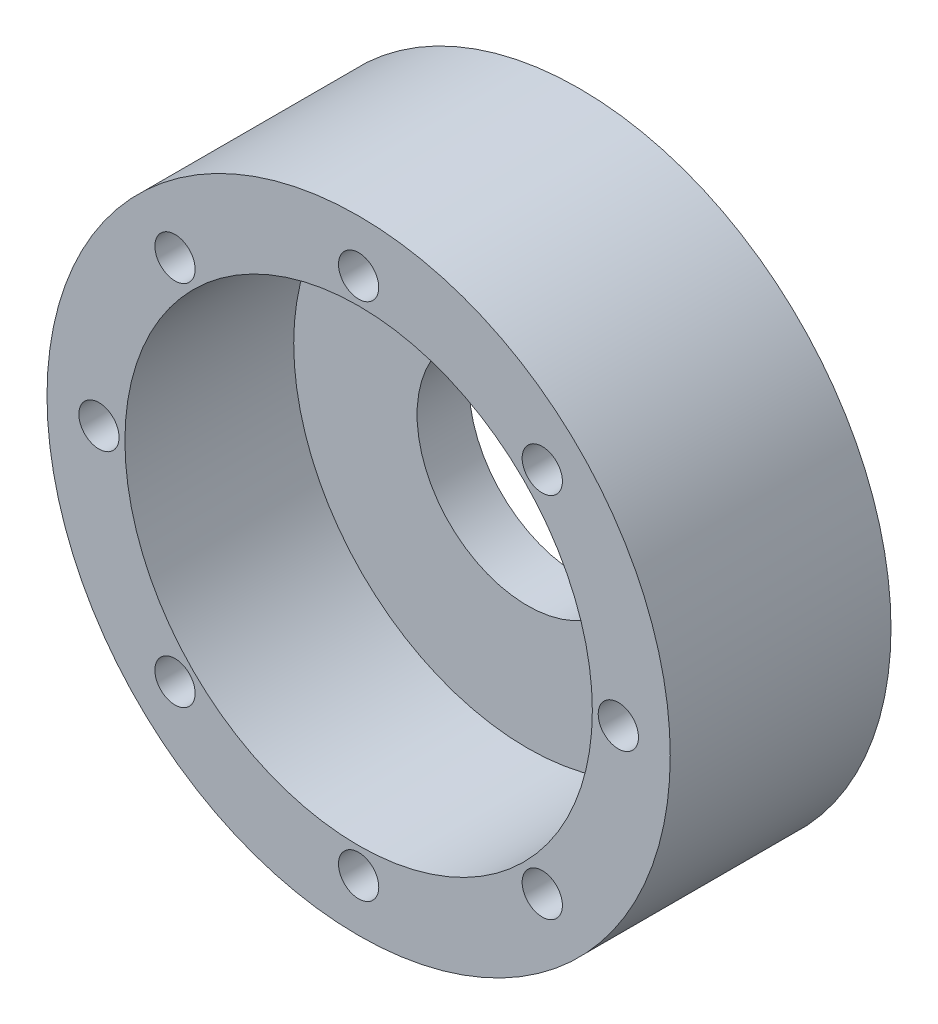
ISO-10303-21;
HEADER;
FILE_DESCRIPTION(('STEP AP214'),'2;1');
FILE_NAME('part.step','',(''),(''),'','','');
FILE_SCHEMA(('AUTOMOTIVE_DESIGN { 1 0 10303 214 1 1 1 1 }'));
ENDSEC;
DATA;
#1=APPLICATION_CONTEXT('core data for automotive mechanical design processes');
#2=APPLICATION_PROTOCOL_DEFINITION('international standard','automotive_design',2000,#1);
#3=PRODUCT_CONTEXT('',#1,'mechanical');
#4=PRODUCT('Part','Part','',(#3));
#5=PRODUCT_RELATED_PRODUCT_CATEGORY('part','',(#4));
#6=PRODUCT_DEFINITION_FORMATION('','',#4);
#7=PRODUCT_DEFINITION_CONTEXT('part definition',#1,'design');
#8=PRODUCT_DEFINITION('design','',#6,#7);
#9=PRODUCT_DEFINITION_SHAPE('','',#8);
#10=(LENGTH_UNIT() NAMED_UNIT(*) SI_UNIT(.MILLI.,.METRE.));
#11=(NAMED_UNIT(*) PLANE_ANGLE_UNIT() SI_UNIT($,.RADIAN.));
#12=(NAMED_UNIT(*) SI_UNIT($,.STERADIAN.) SOLID_ANGLE_UNIT());
#13=UNCERTAINTY_MEASURE_WITH_UNIT(LENGTH_MEASURE(1.E-05),#10,'distance_accuracy_value','');
#14=(GEOMETRIC_REPRESENTATION_CONTEXT(3) GLOBAL_UNCERTAINTY_ASSIGNED_CONTEXT((#13)) GLOBAL_UNIT_ASSIGNED_CONTEXT((#10,
#11,#12)) REPRESENTATION_CONTEXT('',''));
#15=CARTESIAN_POINT('',(0.,0.,0.));
#16=DIRECTION('',(0.,0.,1.));
#17=DIRECTION('',(1.,0.,0.));
#18=AXIS2_PLACEMENT_3D('',#15,#16,#17);
#19=CARTESIAN_POINT('',(0.,0.,17.));
#20=DIRECTION('',(0.,0.,-1.));
#21=DIRECTION('',(-1.,0.,0.));
#22=AXIS2_PLACEMENT_3D('',#19,#20,#21);
#23=CYLINDRICAL_SURFACE('',#22,8.5);
#24=CARTESIAN_POINT('',(0.,0.,0.));
#25=DIRECTION('',(0.,0.,1.));
#26=DIRECTION('',(1.,0.,0.));
#27=AXIS2_PLACEMENT_3D('',#24,#25,#26);
#28=CIRCLE('',#27,8.5);
#29=CARTESIAN_POINT('',(8.5,0.,0.));
#30=VERTEX_POINT('',#29);
#31=EDGE_CURVE('E101',#30,#30,#28,.T.);
#32=ORIENTED_EDGE('',*,*,#31,.F.);
#33=EDGE_LOOP('',(#32));
#34=FACE_BOUND('',#33,.T.);
#35=CARTESIAN_POINT('',(0.,0.,4.));
#36=DIRECTION('',(0.,0.,1.));
#37=DIRECTION('',(1.,0.,0.));
#38=AXIS2_PLACEMENT_3D('',#35,#36,#37);
#39=CIRCLE('',#38,8.5);
#40=CARTESIAN_POINT('',(8.5,0.,4.));
#41=VERTEX_POINT('',#40);
#42=EDGE_CURVE('E36',#41,#41,#39,.T.);
#43=ORIENTED_EDGE('',*,*,#42,.T.);
#44=EDGE_LOOP('',(#43));
#45=FACE_BOUND('',#44,.T.);
#46=ADVANCED_FACE('F32',(#34,#45),#23,.F.);
#47=CARTESIAN_POINT('',(0.,20.,17.));
#48=DIRECTION('',(0.,0.,-1.));
#49=DIRECTION('',(-1.,0.,0.));
#50=AXIS2_PLACEMENT_3D('',#47,#48,#49);
#51=CYLINDRICAL_SURFACE('',#50,1.55);
#52=CARTESIAN_POINT('',(0.,20.,17.));
#53=DIRECTION('',(0.,0.,1.));
#54=DIRECTION('',(1.,0.,0.));
#55=AXIS2_PLACEMENT_3D('',#52,#53,#54);
#56=CIRCLE('',#55,1.55);
#57=CARTESIAN_POINT('',(1.55,20.,17.));
#58=VERTEX_POINT('',#57);
#59=EDGE_CURVE('E45',#58,#58,#56,.T.);
#60=ORIENTED_EDGE('',*,*,#59,.T.);
#61=EDGE_LOOP('',(#60));
#62=FACE_BOUND('',#61,.T.);
#63=CARTESIAN_POINT('',(0.,20.,3.));
#64=DIRECTION('',(0.,0.,-1.));
#65=DIRECTION('',(-1.,0.,0.));
#66=AXIS2_PLACEMENT_3D('',#63,#64,#65);
#67=CIRCLE('',#66,1.55);
#68=CARTESIAN_POINT('',(-1.55,20.,3.));
#69=VERTEX_POINT('',#68);
#70=EDGE_CURVE('E71',#69,#69,#67,.T.);
#71=ORIENTED_EDGE('',*,*,#70,.T.);
#72=EDGE_LOOP('',(#71));
#73=FACE_BOUND('',#72,.T.);
#74=ADVANCED_FACE('F108',(#62,#73),#51,.F.);
#75=CARTESIAN_POINT('',(14.1421356237312,14.1421356237316,17.));
#76=DIRECTION('',(0.,0.,-1.));
#77=DIRECTION('',(-1.,0.,0.));
#78=AXIS2_PLACEMENT_3D('',#75,#76,#77);
#79=CYLINDRICAL_SURFACE('',#78,1.5500000000001);
#80=CARTESIAN_POINT('',(14.1421356237312,14.1421356237316,17.));
#81=DIRECTION('',(0.,0.,1.));
#82=DIRECTION('',(1.,0.,0.));
#83=AXIS2_PLACEMENT_3D('',#80,#81,#82);
#84=CIRCLE('',#83,1.5500000000001);
#85=CARTESIAN_POINT('',(15.6921356237313,14.1421356237316,17.));
#86=VERTEX_POINT('',#85);
#87=EDGE_CURVE('E99',#86,#86,#84,.T.);
#88=ORIENTED_EDGE('',*,*,#87,.T.);
#89=EDGE_LOOP('',(#88));
#90=FACE_BOUND('',#89,.T.);
#91=CARTESIAN_POINT('',(14.1421356237312,14.1421356237316,3.));
#92=DIRECTION('',(0.,0.,-1.));
#93=DIRECTION('',(-1.,0.,0.));
#94=AXIS2_PLACEMENT_3D('',#91,#92,#93);
#95=CIRCLE('',#94,1.5500000000001);
#96=CARTESIAN_POINT('',(12.5921356237311,14.1421356237316,3.));
#97=VERTEX_POINT('',#96);
#98=EDGE_CURVE('E69',#97,#97,#95,.T.);
#99=ORIENTED_EDGE('',*,*,#98,.T.);
#100=EDGE_LOOP('',(#99));
#101=FACE_BOUND('',#100,.T.);
#102=ADVANCED_FACE('F226',(#90,#101),#79,.F.);
#103=CARTESIAN_POINT('',(20.0000000000008,8.50201989313825E-13,17.));
#104=DIRECTION('',(0.,0.,-1.));
#105=DIRECTION('',(-1.,0.,0.));
#106=AXIS2_PLACEMENT_3D('',#103,#104,#105);
#107=CYLINDRICAL_SURFACE('',#106,1.55000000000063);
#108=CARTESIAN_POINT('',(20.0000000000008,8.50201989313825E-13,17.));
#109=DIRECTION('',(0.,0.,1.));
#110=DIRECTION('',(1.,0.,0.));
#111=AXIS2_PLACEMENT_3D('',#108,#109,#110);
#112=CIRCLE('',#111,1.55000000000063);
#113=CARTESIAN_POINT('',(21.5500000000015,8.50201989313825E-13,17.));
#114=VERTEX_POINT('',#113);
#115=EDGE_CURVE('E96',#114,#114,#112,.T.);
#116=ORIENTED_EDGE('',*,*,#115,.T.);
#117=EDGE_LOOP('',(#116));
#118=FACE_BOUND('',#117,.T.);
#119=CARTESIAN_POINT('',(20.0000000000008,8.50201989313825E-13,3.));
#120=DIRECTION('',(0.,0.,-1.));
#121=DIRECTION('',(-1.,0.,0.));
#122=AXIS2_PLACEMENT_3D('',#119,#120,#121);
#123=CIRCLE('',#122,1.55000000000063);
#124=CARTESIAN_POINT('',(18.4500000000002,8.50201989313825E-13,3.));
#125=VERTEX_POINT('',#124);
#126=EDGE_CURVE('E66',#125,#125,#123,.T.);
#127=ORIENTED_EDGE('',*,*,#126,.T.);
#128=EDGE_LOOP('',(#127));
#129=FACE_BOUND('',#128,.T.);
#130=ADVANCED_FACE('F232',(#118,#129),#107,.F.);
#131=CARTESIAN_POINT('',(14.1421356237324,-14.1421356237303,17.));
#132=DIRECTION('',(0.,0.,-1.));
#133=DIRECTION('',(-1.,0.,0.));
#134=AXIS2_PLACEMENT_3D('',#131,#132,#133);
#135=CYLINDRICAL_SURFACE('',#134,1.55000000000131);
#136=CARTESIAN_POINT('',(14.1421356237324,-14.1421356237303,17.));
#137=DIRECTION('',(0.,0.,1.));
#138=DIRECTION('',(1.,0.,0.));
#139=AXIS2_PLACEMENT_3D('',#136,#137,#138);
#140=CIRCLE('',#139,1.55000000000131);
#141=CARTESIAN_POINT('',(15.6921356237337,-14.1421356237303,17.));
#142=VERTEX_POINT('',#141);
#143=EDGE_CURVE('E93',#142,#142,#140,.T.);
#144=ORIENTED_EDGE('',*,*,#143,.T.);
#145=EDGE_LOOP('',(#144));
#146=FACE_BOUND('',#145,.T.);
#147=CARTESIAN_POINT('',(14.1421356237324,-14.1421356237303,3.));
#148=DIRECTION('',(0.,0.,-1.));
#149=DIRECTION('',(-1.,0.,0.));
#150=AXIS2_PLACEMENT_3D('',#147,#148,#149);
#151=CIRCLE('',#150,1.55000000000131);
#152=CARTESIAN_POINT('',(12.5921356237311,-14.1421356237303,3.));
#153=VERTEX_POINT('',#152);
#154=EDGE_CURVE('E63',#153,#153,#151,.T.);
#155=ORIENTED_EDGE('',*,*,#154,.T.);
#156=EDGE_LOOP('',(#155));
#157=FACE_BOUND('',#156,.T.);
#158=ADVANCED_FACE('F236',(#146,#157),#135,.F.);
#159=CARTESIAN_POINT('',(1.70040397862765E-12,-20.,17.));
#160=DIRECTION('',(0.,0.,-1.));
#161=DIRECTION('',(-1.,0.,0.));
#162=AXIS2_PLACEMENT_3D('',#159,#160,#161);
#163=CYLINDRICAL_SURFACE('',#162,1.55000000000176);
#164=CARTESIAN_POINT('',(1.70040397862765E-12,-20.,17.));
#165=DIRECTION('',(0.,0.,1.));
#166=DIRECTION('',(1.,0.,0.));
#167=AXIS2_PLACEMENT_3D('',#164,#165,#166);
#168=CIRCLE('',#167,1.55000000000176);
#169=CARTESIAN_POINT('',(1.55000000000346,-20.,17.));
#170=VERTEX_POINT('',#169);
#171=EDGE_CURVE('E90',#170,#170,#168,.T.);
#172=ORIENTED_EDGE('',*,*,#171,.T.);
#173=EDGE_LOOP('',(#172));
#174=FACE_BOUND('',#173,.T.);
#175=CARTESIAN_POINT('',(1.70040397862765E-12,-20.,3.));
#176=DIRECTION('',(0.,0.,-1.));
#177=DIRECTION('',(-1.,0.,0.));
#178=AXIS2_PLACEMENT_3D('',#175,#176,#177);
#179=CIRCLE('',#178,1.55000000000176);
#180=CARTESIAN_POINT('',(-1.55000000000006,-20.,3.));
#181=VERTEX_POINT('',#180);
#182=EDGE_CURVE('E60',#181,#181,#179,.T.);
#183=ORIENTED_EDGE('',*,*,#182,.T.);
#184=EDGE_LOOP('',(#183));
#185=FACE_BOUND('',#184,.T.);
#186=ADVANCED_FACE('F128',(#174,#185),#163,.F.);
#187=CARTESIAN_POINT('',(-14.1421356237295,-14.1421356237316,17.));
#188=DIRECTION('',(0.,0.,-1.));
#189=DIRECTION('',(-1.,0.,0.));
#190=AXIS2_PLACEMENT_3D('',#187,#188,#189);
#191=CYLINDRICAL_SURFACE('',#190,1.55000000000173);
#192=CARTESIAN_POINT('',(-14.1421356237295,-14.1421356237316,17.));
#193=DIRECTION('',(0.,0.,1.));
#194=DIRECTION('',(1.,0.,0.));
#195=AXIS2_PLACEMENT_3D('',#192,#193,#194);
#196=CIRCLE('',#195,1.55000000000173);
#197=CARTESIAN_POINT('',(-12.5921356237278,-14.1421356237316,17.));
#198=VERTEX_POINT('',#197);
#199=EDGE_CURVE('E82',#198,#198,#196,.T.);
#200=ORIENTED_EDGE('',*,*,#199,.T.);
#201=EDGE_LOOP('',(#200));
#202=FACE_BOUND('',#201,.T.);
#203=CARTESIAN_POINT('',(-14.1421356237295,-14.1421356237316,3.));
#204=DIRECTION('',(0.,0.,-1.));
#205=DIRECTION('',(-1.,0.,0.));
#206=AXIS2_PLACEMENT_3D('',#203,#204,#205);
#207=CIRCLE('',#206,1.55000000000173);
#208=CARTESIAN_POINT('',(-15.6921356237312,-14.1421356237316,3.));
#209=VERTEX_POINT('',#208);
#210=EDGE_CURVE('E57',#209,#209,#207,.T.);
#211=ORIENTED_EDGE('',*,*,#210,.T.);
#212=EDGE_LOOP('',(#211));
#213=FACE_BOUND('',#212,.T.);
#214=ADVANCED_FACE('F124',(#202,#213),#191,.F.);
#215=CARTESIAN_POINT('',(-19.9999999999992,-8.5265128291212E-13,17.));
#216=DIRECTION('',(0.,0.,-1.));
#217=DIRECTION('',(-1.,0.,0.));
#218=AXIS2_PLACEMENT_3D('',#215,#216,#217);
#219=CYLINDRICAL_SURFACE('',#218,1.55000000000126);
#220=CARTESIAN_POINT('',(-19.9999999999992,-8.5265128291212E-13,17.));
#221=DIRECTION('',(0.,0.,1.));
#222=DIRECTION('',(1.,0.,0.));
#223=AXIS2_PLACEMENT_3D('',#220,#221,#222);
#224=CIRCLE('',#223,1.55000000000126);
#225=CARTESIAN_POINT('',(-18.4499999999979,-8.5265128291212E-13,17.));
#226=VERTEX_POINT('',#225);
#227=EDGE_CURVE('E77',#226,#226,#224,.T.);
#228=ORIENTED_EDGE('',*,*,#227,.T.);
#229=EDGE_LOOP('',(#228));
#230=FACE_BOUND('',#229,.T.);
#231=CARTESIAN_POINT('',(-19.9999999999992,-8.5265128291212E-13,3.));
#232=DIRECTION('',(0.,0.,-1.));
#233=DIRECTION('',(-1.,0.,0.));
#234=AXIS2_PLACEMENT_3D('',#231,#232,#233);
#235=CIRCLE('',#234,1.55000000000126);
#236=CARTESIAN_POINT('',(-21.5500000000004,-8.5265128291212E-13,3.));
#237=VERTEX_POINT('',#236);
#238=EDGE_CURVE('E53',#237,#237,#235,.T.);
#239=ORIENTED_EDGE('',*,*,#238,.T.);
#240=EDGE_LOOP('',(#239));
#241=FACE_BOUND('',#240,.T.);
#242=ADVANCED_FACE('F127',(#230,#241),#219,.F.);
#243=CARTESIAN_POINT('',(-14.1421356237307,14.1421356237303,17.));
#244=DIRECTION('',(0.,0.,-1.));
#245=DIRECTION('',(-1.,0.,0.));
#246=AXIS2_PLACEMENT_3D('',#243,#244,#245);
#247=CYLINDRICAL_SURFACE('',#246,1.55000000000065);
#248=CARTESIAN_POINT('',(-14.1421356237307,14.1421356237303,17.));
#249=DIRECTION('',(0.,0.,1.));
#250=DIRECTION('',(1.,0.,0.));
#251=AXIS2_PLACEMENT_3D('',#248,#249,#250);
#252=CIRCLE('',#251,1.55000000000065);
#253=CARTESIAN_POINT('',(-12.5921356237301,14.1421356237303,17.));
#254=VERTEX_POINT('',#253);
#255=EDGE_CURVE('E73',#254,#254,#252,.T.);
#256=ORIENTED_EDGE('',*,*,#255,.T.);
#257=EDGE_LOOP('',(#256));
#258=FACE_BOUND('',#257,.T.);
#259=CARTESIAN_POINT('',(-14.1421356237307,14.1421356237303,3.));
#260=DIRECTION('',(0.,0.,-1.));
#261=DIRECTION('',(-1.,0.,0.));
#262=AXIS2_PLACEMENT_3D('',#259,#260,#261);
#263=CIRCLE('',#262,1.55000000000065);
#264=CARTESIAN_POINT('',(-15.6921356237314,14.1421356237303,3.));
#265=VERTEX_POINT('',#264);
#266=EDGE_CURVE('E50',#265,#265,#263,.T.);
#267=ORIENTED_EDGE('',*,*,#266,.T.);
#268=EDGE_LOOP('',(#267));
#269=FACE_BOUND('',#268,.T.);
#270=ADVANCED_FACE('F114',(#258,#269),#247,.F.);
#271=CARTESIAN_POINT('',(0.,0.,17.));
#272=DIRECTION('',(0.,0.,1.));
#273=DIRECTION('',(1.,0.,0.));
#274=AXIS2_PLACEMENT_3D('',#271,#272,#273);
#275=PLANE('',#274);
#276=CARTESIAN_POINT('',(0.,0.,17.));
#277=DIRECTION('',(0.,0.,1.));
#278=DIRECTION('',(1.,0.,0.));
#279=AXIS2_PLACEMENT_3D('',#276,#277,#278);
#280=CIRCLE('',#279,18.);
#281=CARTESIAN_POINT('',(18.,0.,17.));
#282=VERTEX_POINT('',#281);
#283=EDGE_CURVE('E190',#282,#282,#280,.T.);
#284=ORIENTED_EDGE('',*,*,#283,.F.);
#285=EDGE_LOOP('',(#284));
#286=FACE_BOUND('',#285,.T.);
#287=ORIENTED_EDGE('',*,*,#227,.F.);
#288=EDGE_LOOP('',(#287));
#289=FACE_BOUND('',#288,.T.);
#290=ORIENTED_EDGE('',*,*,#171,.F.);
#291=EDGE_LOOP('',(#290));
#292=FACE_BOUND('',#291,.T.);
#293=ORIENTED_EDGE('',*,*,#115,.F.);
#294=EDGE_LOOP('',(#293));
#295=FACE_BOUND('',#294,.T.);
#296=CARTESIAN_POINT('',(0.,0.,17.));
#297=DIRECTION('',(0.,0.,1.));
#298=DIRECTION('',(1.,0.,0.));
#299=AXIS2_PLACEMENT_3D('',#296,#297,#298);
#300=CIRCLE('',#299,24.);
#301=CARTESIAN_POINT('',(24.,0.,17.));
#302=VERTEX_POINT('',#301);
#303=EDGE_CURVE('E10',#302,#302,#300,.T.);
#304=ORIENTED_EDGE('',*,*,#303,.T.);
#305=EDGE_LOOP('',(#304));
#306=FACE_BOUND('',#305,.T.);
#307=ORIENTED_EDGE('',*,*,#59,.F.);
#308=EDGE_LOOP('',(#307));
#309=FACE_BOUND('',#308,.T.);
#310=ORIENTED_EDGE('',*,*,#87,.F.);
#311=EDGE_LOOP('',(#310));
#312=FACE_BOUND('',#311,.T.);
#313=ORIENTED_EDGE('',*,*,#143,.F.);
#314=EDGE_LOOP('',(#313));
#315=FACE_BOUND('',#314,.T.);
#316=ORIENTED_EDGE('',*,*,#199,.F.);
#317=EDGE_LOOP('',(#316));
#318=FACE_BOUND('',#317,.T.);
#319=ORIENTED_EDGE('',*,*,#255,.F.);
#320=EDGE_LOOP('',(#319));
#321=FACE_BOUND('',#320,.T.);
#322=ADVANCED_FACE('F110',(#286,#289,#292,#295,#306,#309,#312,#315,#318,#321),#275,.T.);
#323=CARTESIAN_POINT('',(0.,0.,0.));
#324=DIRECTION('',(0.,0.,1.));
#325=DIRECTION('',(1.,0.,0.));
#326=AXIS2_PLACEMENT_3D('',#323,#324,#325);
#327=PLANE('',#326);
#328=CARTESIAN_POINT('',(14.1421356237307,14.1421356237303,0.));
#329=DIRECTION('',(0.,0.,-1.));
#330=DIRECTION('',(-1.,0.,0.));
#331=AXIS2_PLACEMENT_3D('',#328,#329,#330);
#332=CIRCLE('',#331,3.5);
#333=CARTESIAN_POINT('',(10.6421356237307,14.1421356237303,0.));
#334=VERTEX_POINT('',#333);
#335=EDGE_CURVE('E173',#334,#334,#332,.T.);
#336=ORIENTED_EDGE('',*,*,#335,.F.);
#337=EDGE_LOOP('',(#336));
#338=FACE_BOUND('',#337,.T.);
#339=CARTESIAN_POINT('',(19.9999999999992,-8.5265128291212E-13,0.));
#340=DIRECTION('',(0.,0.,-1.));
#341=DIRECTION('',(-1.,0.,0.));
#342=AXIS2_PLACEMENT_3D('',#339,#340,#341);
#343=CIRCLE('',#342,3.5);
#344=CARTESIAN_POINT('',(16.4999999999992,-8.5265128291212E-13,0.));
#345=VERTEX_POINT('',#344);
#346=EDGE_CURVE('E167',#345,#345,#343,.T.);
#347=ORIENTED_EDGE('',*,*,#346,.F.);
#348=EDGE_LOOP('',(#347));
#349=FACE_BOUND('',#348,.T.);
#350=CARTESIAN_POINT('',(14.1421356237295,-14.1421356237316,0.));
#351=DIRECTION('',(0.,0.,-1.));
#352=DIRECTION('',(-1.,0.,0.));
#353=AXIS2_PLACEMENT_3D('',#350,#351,#352);
#354=CIRCLE('',#353,3.5);
#355=CARTESIAN_POINT('',(10.6421356237295,-14.1421356237316,0.));
#356=VERTEX_POINT('',#355);
#357=EDGE_CURVE('E161',#356,#356,#354,.T.);
#358=ORIENTED_EDGE('',*,*,#357,.F.);
#359=EDGE_LOOP('',(#358));
#360=FACE_BOUND('',#359,.T.);
#361=CARTESIAN_POINT('',(-1.70040397862765E-12,-20.,0.));
#362=DIRECTION('',(0.,0.,-1.));
#363=DIRECTION('',(-1.,0.,0.));
#364=AXIS2_PLACEMENT_3D('',#361,#362,#363);
#365=CIRCLE('',#364,3.5);
#366=CARTESIAN_POINT('',(-3.5000000000017,-20.,0.));
#367=VERTEX_POINT('',#366);
#368=EDGE_CURVE('E155',#367,#367,#365,.T.);
#369=ORIENTED_EDGE('',*,*,#368,.F.);
#370=EDGE_LOOP('',(#369));
#371=FACE_BOUND('',#370,.T.);
#372=CARTESIAN_POINT('',(-14.1421356237324,-14.1421356237303,0.));
#373=DIRECTION('',(0.,0.,-1.));
#374=DIRECTION('',(-1.,0.,0.));
#375=AXIS2_PLACEMENT_3D('',#372,#373,#374);
#376=CIRCLE('',#375,3.5);
#377=CARTESIAN_POINT('',(-17.6421356237324,-14.1421356237303,0.));
#378=VERTEX_POINT('',#377);
#379=EDGE_CURVE('E143',#378,#378,#376,.T.);
#380=ORIENTED_EDGE('',*,*,#379,.F.);
#381=EDGE_LOOP('',(#380));
#382=FACE_BOUND('',#381,.T.);
#383=CARTESIAN_POINT('',(-20.0000000000008,8.50201989313825E-13,0.));
#384=DIRECTION('',(0.,0.,-1.));
#385=DIRECTION('',(-1.,0.,0.));
#386=AXIS2_PLACEMENT_3D('',#383,#384,#385);
#387=CIRCLE('',#386,3.5);
#388=CARTESIAN_POINT('',(-23.5000000000008,8.50201989313825E-13,0.));
#389=VERTEX_POINT('',#388);
#390=EDGE_CURVE('E142',#389,#389,#387,.T.);
#391=ORIENTED_EDGE('',*,*,#390,.F.);
#392=EDGE_LOOP('',(#391));
#393=FACE_BOUND('',#392,.T.);
#394=CARTESIAN_POINT('',(-14.1421356237312,14.1421356237316,0.));
#395=DIRECTION('',(0.,0.,-1.));
#396=DIRECTION('',(-1.,0.,0.));
#397=AXIS2_PLACEMENT_3D('',#394,#395,#396);
#398=CIRCLE('',#397,3.5);
#399=CARTESIAN_POINT('',(-17.6421356237312,14.1421356237316,0.));
#400=VERTEX_POINT('',#399);
#401=EDGE_CURVE('E183',#400,#400,#398,.T.);
#402=ORIENTED_EDGE('',*,*,#401,.F.);
#403=EDGE_LOOP('',(#402));
#404=FACE_BOUND('',#403,.T.);
#405=CARTESIAN_POINT('',(0.,20.,0.));
#406=DIRECTION('',(0.,0.,-1.));
#407=DIRECTION('',(-1.,0.,0.));
#408=AXIS2_PLACEMENT_3D('',#405,#406,#407);
#409=CIRCLE('',#408,3.5);
#410=CARTESIAN_POINT('',(-3.5,20.,0.));
#411=VERTEX_POINT('',#410);
#412=EDGE_CURVE('E85',#411,#411,#409,.T.);
#413=ORIENTED_EDGE('',*,*,#412,.F.);
#414=EDGE_LOOP('',(#413));
#415=FACE_BOUND('',#414,.T.);
#416=CARTESIAN_POINT('',(0.,0.,0.));
#417=DIRECTION('',(0.,0.,1.));
#418=DIRECTION('',(1.,0.,0.));
#419=AXIS2_PLACEMENT_3D('',#416,#417,#418);
#420=CIRCLE('',#419,24.);
#421=CARTESIAN_POINT('',(24.,0.,0.));
#422=VERTEX_POINT('',#421);
#423=EDGE_CURVE('E40',#422,#422,#420,.T.);
#424=ORIENTED_EDGE('',*,*,#423,.F.);
#425=EDGE_LOOP('',(#424));
#426=FACE_BOUND('',#425,.T.);
#427=ORIENTED_EDGE('',*,*,#31,.T.);
#428=EDGE_LOOP('',(#427));
#429=FACE_BOUND('',#428,.T.);
#430=ADVANCED_FACE('F113',(#338,#349,#360,#371,#382,#393,#404,#415,#426,#429),#327,.F.);
#431=CARTESIAN_POINT('',(0.,0.,17.));
#432=DIRECTION('',(0.,0.,-1.));
#433=DIRECTION('',(-1.,0.,0.));
#434=AXIS2_PLACEMENT_3D('',#431,#432,#433);
#435=CYLINDRICAL_SURFACE('',#434,24.);
#436=ORIENTED_EDGE('',*,*,#303,.F.);
#437=EDGE_LOOP('',(#436));
#438=FACE_BOUND('',#437,.T.);
#439=ORIENTED_EDGE('',*,*,#423,.T.);
#440=EDGE_LOOP('',(#439));
#441=FACE_BOUND('',#440,.T.);
#442=ADVANCED_FACE('F34',(#438,#441),#435,.T.);
#443=CARTESIAN_POINT('',(-14.1421356237312,14.1421356237316,3.));
#444=DIRECTION('',(0.,0.,-1.));
#445=DIRECTION('',(-1.,0.,0.));
#446=AXIS2_PLACEMENT_3D('',#443,#444,#445);
#447=CYLINDRICAL_SURFACE('',#446,3.5);
#448=CARTESIAN_POINT('',(-14.1421356237312,14.1421356237316,3.));
#449=DIRECTION('',(0.,0.,-1.));
#450=DIRECTION('',(-1.,0.,0.));
#451=AXIS2_PLACEMENT_3D('',#448,#449,#450);
#452=CIRCLE('',#451,3.5);
#453=CARTESIAN_POINT('',(-17.6421356237312,14.1421356237316,3.));
#454=VERTEX_POINT('',#453);
#455=EDGE_CURVE('E179',#454,#454,#452,.T.);
#456=ORIENTED_EDGE('',*,*,#455,.F.);
#457=EDGE_LOOP('',(#456));
#458=FACE_BOUND('',#457,.T.);
#459=ORIENTED_EDGE('',*,*,#401,.T.);
#460=EDGE_LOOP('',(#459));
#461=FACE_BOUND('',#460,.T.);
#462=ADVANCED_FACE('F213',(#458,#461),#447,.F.);
#463=CARTESIAN_POINT('',(-14.1421356237312,14.1421356237316,3.));
#464=DIRECTION('',(0.,0.,-1.));
#465=DIRECTION('',(-1.,0.,0.));
#466=AXIS2_PLACEMENT_3D('',#463,#464,#465);
#467=PLANE('',#466);
#468=ORIENTED_EDGE('',*,*,#266,.F.);
#469=EDGE_LOOP('',(#468));
#470=FACE_BOUND('',#469,.T.);
#471=ORIENTED_EDGE('',*,*,#455,.T.);
#472=EDGE_LOOP('',(#471));
#473=FACE_BOUND('',#472,.T.);
#474=ADVANCED_FACE('F200',(#470,#473),#467,.T.);
#475=CARTESIAN_POINT('',(-20.0000000000008,8.50201989313825E-13,3.));
#476=DIRECTION('',(0.,0.,-1.));
#477=DIRECTION('',(-1.,0.,0.));
#478=AXIS2_PLACEMENT_3D('',#475,#476,#477);
#479=CYLINDRICAL_SURFACE('',#478,3.5);
#480=CARTESIAN_POINT('',(-20.0000000000008,8.50201989313825E-13,3.));
#481=DIRECTION('',(0.,0.,-1.));
#482=DIRECTION('',(-1.,0.,0.));
#483=AXIS2_PLACEMENT_3D('',#480,#481,#482);
#484=CIRCLE('',#483,3.5);
#485=CARTESIAN_POINT('',(-23.5000000000008,8.50201989313825E-13,3.));
#486=VERTEX_POINT('',#485);
#487=EDGE_CURVE('E146',#486,#486,#484,.T.);
#488=ORIENTED_EDGE('',*,*,#487,.F.);
#489=EDGE_LOOP('',(#488));
#490=FACE_BOUND('',#489,.T.);
#491=ORIENTED_EDGE('',*,*,#390,.T.);
#492=EDGE_LOOP('',(#491));
#493=FACE_BOUND('',#492,.T.);
#494=ADVANCED_FACE('F197',(#490,#493),#479,.F.);
#495=CARTESIAN_POINT('',(-20.0000000000008,8.50201989313825E-13,3.));
#496=DIRECTION('',(0.,0.,-1.));
#497=DIRECTION('',(-1.,0.,0.));
#498=AXIS2_PLACEMENT_3D('',#495,#496,#497);
#499=PLANE('',#498);
#500=ORIENTED_EDGE('',*,*,#238,.F.);
#501=EDGE_LOOP('',(#500));
#502=FACE_BOUND('',#501,.T.);
#503=ORIENTED_EDGE('',*,*,#487,.T.);
#504=EDGE_LOOP('',(#503));
#505=FACE_BOUND('',#504,.T.);
#506=ADVANCED_FACE('F195',(#502,#505),#499,.T.);
#507=CARTESIAN_POINT('',(-14.1421356237324,-14.1421356237303,3.));
#508=DIRECTION('',(0.,0.,-1.));
#509=DIRECTION('',(-1.,0.,0.));
#510=AXIS2_PLACEMENT_3D('',#507,#508,#509);
#511=CYLINDRICAL_SURFACE('',#510,3.5);
#512=CARTESIAN_POINT('',(-14.1421356237324,-14.1421356237303,3.));
#513=DIRECTION('',(0.,0.,-1.));
#514=DIRECTION('',(-1.,0.,0.));
#515=AXIS2_PLACEMENT_3D('',#512,#513,#514);
#516=CIRCLE('',#515,3.5);
#517=CARTESIAN_POINT('',(-17.6421356237324,-14.1421356237303,3.));
#518=VERTEX_POINT('',#517);
#519=EDGE_CURVE('E140',#518,#518,#516,.T.);
#520=ORIENTED_EDGE('',*,*,#519,.F.);
#521=EDGE_LOOP('',(#520));
#522=FACE_BOUND('',#521,.T.);
#523=ORIENTED_EDGE('',*,*,#379,.T.);
#524=EDGE_LOOP('',(#523));
#525=FACE_BOUND('',#524,.T.);
#526=ADVANCED_FACE('F136',(#522,#525),#511,.F.);
#527=CARTESIAN_POINT('',(-14.1421356237324,-14.1421356237303,3.));
#528=DIRECTION('',(0.,0.,-1.));
#529=DIRECTION('',(-1.,0.,0.));
#530=AXIS2_PLACEMENT_3D('',#527,#528,#529);
#531=PLANE('',#530);
#532=ORIENTED_EDGE('',*,*,#210,.F.);
#533=EDGE_LOOP('',(#532));
#534=FACE_BOUND('',#533,.T.);
#535=ORIENTED_EDGE('',*,*,#519,.T.);
#536=EDGE_LOOP('',(#535));
#537=FACE_BOUND('',#536,.T.);
#538=ADVANCED_FACE('F132',(#534,#537),#531,.T.);
#539=CARTESIAN_POINT('',(-1.70040397862765E-12,-20.,3.));
#540=DIRECTION('',(0.,0.,-1.));
#541=DIRECTION('',(-1.,0.,0.));
#542=AXIS2_PLACEMENT_3D('',#539,#540,#541);
#543=CYLINDRICAL_SURFACE('',#542,3.5);
#544=CARTESIAN_POINT('',(-1.70040397862765E-12,-20.,3.));
#545=DIRECTION('',(0.,0.,-1.));
#546=DIRECTION('',(-1.,0.,0.));
#547=AXIS2_PLACEMENT_3D('',#544,#545,#546);
#548=CIRCLE('',#547,3.5);
#549=CARTESIAN_POINT('',(-3.5000000000017,-20.,3.));
#550=VERTEX_POINT('',#549);
#551=EDGE_CURVE('E149',#550,#550,#548,.T.);
#552=ORIENTED_EDGE('',*,*,#551,.F.);
#553=EDGE_LOOP('',(#552));
#554=FACE_BOUND('',#553,.T.);
#555=ORIENTED_EDGE('',*,*,#368,.T.);
#556=EDGE_LOOP('',(#555));
#557=FACE_BOUND('',#556,.T.);
#558=ADVANCED_FACE('F135',(#554,#557),#543,.F.);
#559=CARTESIAN_POINT('',(-1.70040397862765E-12,-20.,3.));
#560=DIRECTION('',(0.,0.,-1.));
#561=DIRECTION('',(-1.,0.,0.));
#562=AXIS2_PLACEMENT_3D('',#559,#560,#561);
#563=PLANE('',#562);
#564=ORIENTED_EDGE('',*,*,#182,.F.);
#565=EDGE_LOOP('',(#564));
#566=FACE_BOUND('',#565,.T.);
#567=ORIENTED_EDGE('',*,*,#551,.T.);
#568=EDGE_LOOP('',(#567));
#569=FACE_BOUND('',#568,.T.);
#570=ADVANCED_FACE('F278',(#566,#569),#563,.T.);
#571=CARTESIAN_POINT('',(14.1421356237295,-14.1421356237316,3.));
#572=DIRECTION('',(0.,0.,-1.));
#573=DIRECTION('',(-1.,0.,0.));
#574=AXIS2_PLACEMENT_3D('',#571,#572,#573);
#575=CYLINDRICAL_SURFACE('',#574,3.5);
#576=CARTESIAN_POINT('',(14.1421356237295,-14.1421356237316,3.));
#577=DIRECTION('',(0.,0.,-1.));
#578=DIRECTION('',(-1.,0.,0.));
#579=AXIS2_PLACEMENT_3D('',#576,#577,#578);
#580=CIRCLE('',#579,3.5);
#581=CARTESIAN_POINT('',(10.6421356237295,-14.1421356237316,3.));
#582=VERTEX_POINT('',#581);
#583=EDGE_CURVE('E158',#582,#582,#580,.T.);
#584=ORIENTED_EDGE('',*,*,#583,.F.);
#585=EDGE_LOOP('',(#584));
#586=FACE_BOUND('',#585,.T.);
#587=ORIENTED_EDGE('',*,*,#357,.T.);
#588=EDGE_LOOP('',(#587));
#589=FACE_BOUND('',#588,.T.);
#590=ADVANCED_FACE('F275',(#586,#589),#575,.F.);
#591=CARTESIAN_POINT('',(14.1421356237295,-14.1421356237316,3.));
#592=DIRECTION('',(0.,0.,-1.));
#593=DIRECTION('',(-1.,0.,0.));
#594=AXIS2_PLACEMENT_3D('',#591,#592,#593);
#595=PLANE('',#594);
#596=ORIENTED_EDGE('',*,*,#154,.F.);
#597=EDGE_LOOP('',(#596));
#598=FACE_BOUND('',#597,.T.);
#599=ORIENTED_EDGE('',*,*,#583,.T.);
#600=EDGE_LOOP('',(#599));
#601=FACE_BOUND('',#600,.T.);
#602=ADVANCED_FACE('F270',(#598,#601),#595,.T.);
#603=CARTESIAN_POINT('',(19.9999999999992,-8.5265128291212E-13,3.));
#604=DIRECTION('',(0.,0.,-1.));
#605=DIRECTION('',(-1.,0.,0.));
#606=AXIS2_PLACEMENT_3D('',#603,#604,#605);
#607=CYLINDRICAL_SURFACE('',#606,3.5);
#608=CARTESIAN_POINT('',(19.9999999999992,-8.5265128291212E-13,3.));
#609=DIRECTION('',(0.,0.,-1.));
#610=DIRECTION('',(-1.,0.,0.));
#611=AXIS2_PLACEMENT_3D('',#608,#609,#610);
#612=CIRCLE('',#611,3.5);
#613=CARTESIAN_POINT('',(16.4999999999992,-8.5265128291212E-13,3.));
#614=VERTEX_POINT('',#613);
#615=EDGE_CURVE('E164',#614,#614,#612,.T.);
#616=ORIENTED_EDGE('',*,*,#615,.F.);
#617=EDGE_LOOP('',(#616));
#618=FACE_BOUND('',#617,.T.);
#619=ORIENTED_EDGE('',*,*,#346,.T.);
#620=EDGE_LOOP('',(#619));
#621=FACE_BOUND('',#620,.T.);
#622=ADVANCED_FACE('F267',(#618,#621),#607,.F.);
#623=CARTESIAN_POINT('',(19.9999999999992,-8.5265128291212E-13,3.));
#624=DIRECTION('',(0.,0.,-1.));
#625=DIRECTION('',(-1.,0.,0.));
#626=AXIS2_PLACEMENT_3D('',#623,#624,#625);
#627=PLANE('',#626);
#628=ORIENTED_EDGE('',*,*,#126,.F.);
#629=EDGE_LOOP('',(#628));
#630=FACE_BOUND('',#629,.T.);
#631=ORIENTED_EDGE('',*,*,#615,.T.);
#632=EDGE_LOOP('',(#631));
#633=FACE_BOUND('',#632,.T.);
#634=ADVANCED_FACE('F262',(#630,#633),#627,.T.);
#635=CARTESIAN_POINT('',(14.1421356237307,14.1421356237303,3.));
#636=DIRECTION('',(0.,0.,-1.));
#637=DIRECTION('',(-1.,0.,0.));
#638=AXIS2_PLACEMENT_3D('',#635,#636,#637);
#639=CYLINDRICAL_SURFACE('',#638,3.5);
#640=CARTESIAN_POINT('',(14.1421356237307,14.1421356237303,3.));
#641=DIRECTION('',(0.,0.,-1.));
#642=DIRECTION('',(-1.,0.,0.));
#643=AXIS2_PLACEMENT_3D('',#640,#641,#642);
#644=CIRCLE('',#643,3.5);
#645=CARTESIAN_POINT('',(10.6421356237307,14.1421356237303,3.));
#646=VERTEX_POINT('',#645);
#647=EDGE_CURVE('E170',#646,#646,#644,.T.);
#648=ORIENTED_EDGE('',*,*,#647,.F.);
#649=EDGE_LOOP('',(#648));
#650=FACE_BOUND('',#649,.T.);
#651=ORIENTED_EDGE('',*,*,#335,.T.);
#652=EDGE_LOOP('',(#651));
#653=FACE_BOUND('',#652,.T.);
#654=ADVANCED_FACE('F259',(#650,#653),#639,.F.);
#655=CARTESIAN_POINT('',(14.1421356237307,14.1421356237303,3.));
#656=DIRECTION('',(0.,0.,-1.));
#657=DIRECTION('',(-1.,0.,0.));
#658=AXIS2_PLACEMENT_3D('',#655,#656,#657);
#659=PLANE('',#658);
#660=ORIENTED_EDGE('',*,*,#98,.F.);
#661=EDGE_LOOP('',(#660));
#662=FACE_BOUND('',#661,.T.);
#663=ORIENTED_EDGE('',*,*,#647,.T.);
#664=EDGE_LOOP('',(#663));
#665=FACE_BOUND('',#664,.T.);
#666=ADVANCED_FACE('F253',(#662,#665),#659,.T.);
#667=CARTESIAN_POINT('',(0.,20.,3.));
#668=DIRECTION('',(0.,0.,-1.));
#669=DIRECTION('',(-1.,0.,0.));
#670=AXIS2_PLACEMENT_3D('',#667,#668,#669);
#671=CYLINDRICAL_SURFACE('',#670,3.5);
#672=CARTESIAN_POINT('',(0.,20.,3.));
#673=DIRECTION('',(0.,0.,-1.));
#674=DIRECTION('',(-1.,0.,0.));
#675=AXIS2_PLACEMENT_3D('',#672,#673,#674);
#676=CIRCLE('',#675,3.5);
#677=CARTESIAN_POINT('',(-3.5,20.,3.));
#678=VERTEX_POINT('',#677);
#679=EDGE_CURVE('E54',#678,#678,#676,.T.);
#680=ORIENTED_EDGE('',*,*,#679,.F.);
#681=EDGE_LOOP('',(#680));
#682=FACE_BOUND('',#681,.T.);
#683=ORIENTED_EDGE('',*,*,#412,.T.);
#684=EDGE_LOOP('',(#683));
#685=FACE_BOUND('',#684,.T.);
#686=ADVANCED_FACE('F249',(#682,#685),#671,.F.);
#687=CARTESIAN_POINT('',(0.,20.,3.));
#688=DIRECTION('',(0.,0.,-1.));
#689=DIRECTION('',(-1.,0.,0.));
#690=AXIS2_PLACEMENT_3D('',#687,#688,#689);
#691=PLANE('',#690);
#692=ORIENTED_EDGE('',*,*,#70,.F.);
#693=EDGE_LOOP('',(#692));
#694=FACE_BOUND('',#693,.T.);
#695=ORIENTED_EDGE('',*,*,#679,.T.);
#696=EDGE_LOOP('',(#695));
#697=FACE_BOUND('',#696,.T.);
#698=ADVANCED_FACE('F252',(#694,#697),#691,.T.);
#699=CARTESIAN_POINT('',(0.,0.,4.));
#700=DIRECTION('',(0.,0.,1.));
#701=DIRECTION('',(1.,0.,0.));
#702=AXIS2_PLACEMENT_3D('',#699,#700,#701);
#703=CYLINDRICAL_SURFACE('',#702,18.);
#704=CARTESIAN_POINT('',(0.,0.,4.));
#705=DIRECTION('',(0.,0.,1.));
#706=DIRECTION('',(1.,0.,0.));
#707=AXIS2_PLACEMENT_3D('',#704,#705,#706);
#708=CIRCLE('',#707,18.);
#709=CARTESIAN_POINT('',(18.,0.,4.));
#710=VERTEX_POINT('',#709);
#711=EDGE_CURVE('E310',#710,#710,#708,.T.);
#712=CARTESIAN_POINT('',(18.,0.,4.));
#713=CARTESIAN_POINT('',(18.,0.,4.13541666666667));
#714=CARTESIAN_POINT('',(18.,0.,4.27083333333333));
#715=CARTESIAN_POINT('',(18.,0.,4.54166666666667));
#716=CARTESIAN_POINT('',(18.,0.,4.67708333333333));
#717=CARTESIAN_POINT('',(18.,0.,4.94791666666667));
#718=CARTESIAN_POINT('',(18.,0.,5.08333333333333));
#719=CARTESIAN_POINT('',(18.,0.,5.35416666666667));
#720=CARTESIAN_POINT('',(18.,0.,5.48958333333333));
#721=CARTESIAN_POINT('',(18.,0.,5.76041666666667));
#722=CARTESIAN_POINT('',(18.,0.,5.89583333333333));
#723=CARTESIAN_POINT('',(18.,0.,6.16666666666667));
#724=CARTESIAN_POINT('',(18.,0.,6.30208333333333));
#725=CARTESIAN_POINT('',(18.,0.,6.57291666666667));
#726=CARTESIAN_POINT('',(18.,0.,6.70833333333333));
#727=CARTESIAN_POINT('',(18.,0.,6.97916666666667));
#728=CARTESIAN_POINT('',(18.,0.,7.11458333333333));
#729=CARTESIAN_POINT('',(18.,0.,7.38541666666667));
#730=CARTESIAN_POINT('',(18.,0.,7.52083333333333));
#731=CARTESIAN_POINT('',(18.,0.,7.79166666666667));
#732=CARTESIAN_POINT('',(18.,0.,7.92708333333333));
#733=CARTESIAN_POINT('',(18.,0.,8.19791666666667));
#734=CARTESIAN_POINT('',(18.,0.,8.33333333333333));
#735=CARTESIAN_POINT('',(18.,0.,8.60416666666667));
#736=CARTESIAN_POINT('',(18.,0.,8.73958333333333));
#737=CARTESIAN_POINT('',(18.,0.,9.01041666666667));
#738=CARTESIAN_POINT('',(18.,0.,9.14583333333333));
#739=CARTESIAN_POINT('',(18.,0.,9.41666666666667));
#740=CARTESIAN_POINT('',(18.,0.,9.55208333333333));
#741=CARTESIAN_POINT('',(18.,0.,9.82291666666667));
#742=CARTESIAN_POINT('',(18.,0.,9.95833333333333));
#743=CARTESIAN_POINT('',(18.,0.,10.2291666666667));
#744=CARTESIAN_POINT('',(18.,0.,10.3645833333333));
#745=CARTESIAN_POINT('',(18.,0.,10.6354166666667));
#746=CARTESIAN_POINT('',(18.,0.,10.7708333333333));
#747=CARTESIAN_POINT('',(18.,0.,11.0416666666667));
#748=CARTESIAN_POINT('',(18.,0.,11.1770833333333));
#749=CARTESIAN_POINT('',(18.,0.,11.4479166666667));
#750=CARTESIAN_POINT('',(18.,0.,11.5833333333333));
#751=CARTESIAN_POINT('',(18.,0.,11.8541666666667));
#752=CARTESIAN_POINT('',(18.,0.,11.9895833333333));
#753=CARTESIAN_POINT('',(18.,0.,12.2604166666667));
#754=CARTESIAN_POINT('',(18.,0.,12.3958333333333));
#755=CARTESIAN_POINT('',(18.,0.,12.6666666666667));
#756=CARTESIAN_POINT('',(18.,0.,12.8020833333333));
#757=CARTESIAN_POINT('',(18.,0.,13.0729166666667));
#758=CARTESIAN_POINT('',(18.,0.,13.2083333333333));
#759=CARTESIAN_POINT('',(18.,0.,13.4791666666667));
#760=CARTESIAN_POINT('',(18.,0.,13.6145833333333));
#761=CARTESIAN_POINT('',(18.,0.,13.8854166666667));
#762=CARTESIAN_POINT('',(18.,0.,14.0208333333333));
#763=CARTESIAN_POINT('',(18.,0.,14.2916666666667));
#764=CARTESIAN_POINT('',(18.,0.,14.4270833333333));
#765=CARTESIAN_POINT('',(18.,0.,14.6979166666667));
#766=CARTESIAN_POINT('',(18.,0.,14.8333333333333));
#767=CARTESIAN_POINT('',(18.,0.,15.1041666666667));
#768=CARTESIAN_POINT('',(18.,0.,15.2395833333333));
#769=CARTESIAN_POINT('',(18.,0.,15.5104166666667));
#770=CARTESIAN_POINT('',(18.,0.,15.6458333333333));
#771=CARTESIAN_POINT('',(18.,0.,15.9166666666667));
#772=CARTESIAN_POINT('',(18.,0.,16.0520833333333));
#773=CARTESIAN_POINT('',(18.,0.,16.3229166666667));
#774=CARTESIAN_POINT('',(18.,0.,16.4583333333333));
#775=CARTESIAN_POINT('',(18.,0.,16.7291666666667));
#776=CARTESIAN_POINT('',(18.,0.,16.8645833333333));
#777=CARTESIAN_POINT('',(18.,0.,17.));
#778=B_SPLINE_CURVE_WITH_KNOTS('',3,(#712,#713,#714,#715,#716,#717,#718,#719,#720,#721,#722,
#723,#724,#725,#726,#727,#728,#729,#730,#731,#732,#733,#734,#735,#736,#737,#738,#739,#740,#741,
#742,#743,#744,#745,#746,#747,#748,#749,#750,#751,#752,#753,#754,#755,#756,#757,#758,#759,#760,
#761,#762,#763,#764,#765,#766,#767,#768,#769,#770,#771,#772,#773,#774,#775,#776,#777),
.UNSPECIFIED.,.F.,.F.,(4,2,2,2,2,2,2,2,2,2,2,2,2,2,2,2,2,2,2,2,2,2,2,2,2,2,2,2,2,2,2,2,4),(0.,
0.40625,0.8125,1.21875,1.625,2.03125,2.4375,2.84375,3.25,3.65625,4.0625,4.46875,4.875,5.28125,
5.6875,6.09375,6.5,6.90625,7.3125,7.71875,8.125,8.53125,8.9375,9.34375,9.75,10.15625,10.5625,
10.96875,11.375,11.78125,12.1875,12.59375,13.),.UNSPECIFIED.);
#779=EDGE_CURVE('BSEAM257',#710,#282,#778,.T.);
#780=ORIENTED_EDGE('',*,*,#711,.F.);
#781=ORIENTED_EDGE('',*,*,#283,.T.);
#782=ORIENTED_EDGE('',*,*,#779,.T.);
#783=ORIENTED_EDGE('',*,*,#779,.F.);
#784=EDGE_LOOP('',(#780,#782,#781,#783));
#785=FACE_BOUND('',#784,.T.);
#786=ADVANCED_FACE('F257',(#785),#703,.F.);
#787=CARTESIAN_POINT('',(0.,0.,4.));
#788=DIRECTION('',(0.,0.,1.));
#789=DIRECTION('',(1.,0.,0.));
#790=AXIS2_PLACEMENT_3D('',#787,#788,#789);
#791=PLANE('',#790);
#792=ORIENTED_EDGE('',*,*,#42,.F.);
#793=EDGE_LOOP('',(#792));
#794=FACE_BOUND('',#793,.T.);
#795=ORIENTED_EDGE('',*,*,#711,.T.);
#796=EDGE_LOOP('',(#795));
#797=FACE_BOUND('',#796,.T.);
#798=ADVANCED_FACE('F299',(#794,#797),#791,.T.);
#799=CLOSED_SHELL('',(#46,#74,#102,#130,#158,#186,#214,#242,#270,#322,#430,#442,#462,#474,#494,
#506,#526,#538,#558,#570,#590,#602,#622,#634,#654,#666,#686,#698,#786,#798));
#800=MANIFOLD_SOLID_BREP('B2',#799);
#801=ADVANCED_BREP_SHAPE_REPRESENTATION('',(#18,#800),#14);
#802=SHAPE_DEFINITION_REPRESENTATION(#9,#801);
ENDSEC;
END-ISO-10303-21;
